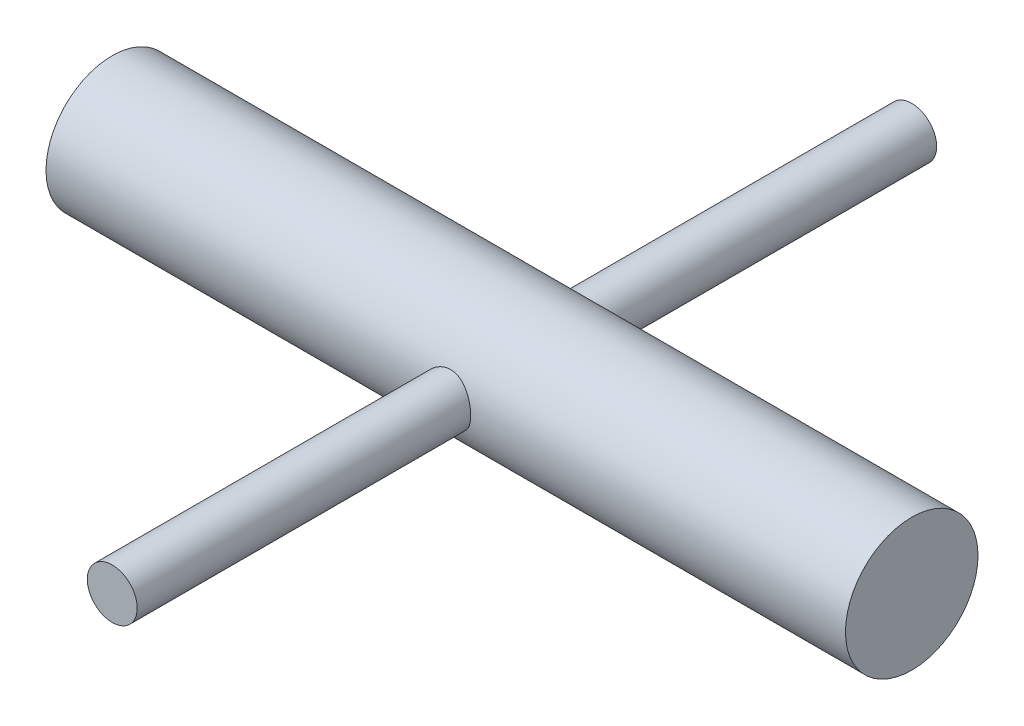
ISO-10303-21;
HEADER;
FILE_DESCRIPTION(('STEP AP214'),'2;1');
FILE_NAME('part.step','',(''),(''),'','','');
FILE_SCHEMA(('AUTOMOTIVE_DESIGN { 1 0 10303 214 1 1 1 1 }'));
ENDSEC;
DATA;
#1=APPLICATION_CONTEXT('core data for automotive mechanical design processes');
#2=APPLICATION_PROTOCOL_DEFINITION('international standard','automotive_design',2000,#1);
#3=PRODUCT_CONTEXT('',#1,'mechanical');
#4=PRODUCT('Part','Part','',(#3));
#5=PRODUCT_RELATED_PRODUCT_CATEGORY('part','',(#4));
#6=PRODUCT_DEFINITION_FORMATION('','',#4);
#7=PRODUCT_DEFINITION_CONTEXT('part definition',#1,'design');
#8=PRODUCT_DEFINITION('design','',#6,#7);
#9=PRODUCT_DEFINITION_SHAPE('','',#8);
#10=(LENGTH_UNIT() NAMED_UNIT(*) SI_UNIT(.MILLI.,.METRE.));
#11=(NAMED_UNIT(*) PLANE_ANGLE_UNIT() SI_UNIT($,.RADIAN.));
#12=(NAMED_UNIT(*) SI_UNIT($,.STERADIAN.) SOLID_ANGLE_UNIT());
#13=UNCERTAINTY_MEASURE_WITH_UNIT(LENGTH_MEASURE(1.E-05),#10,'distance_accuracy_value','');
#14=(GEOMETRIC_REPRESENTATION_CONTEXT(3) GLOBAL_UNCERTAINTY_ASSIGNED_CONTEXT((#13)) GLOBAL_UNIT_ASSIGNED_CONTEXT((#10,
#11,#12)) REPRESENTATION_CONTEXT('',''));
#15=CARTESIAN_POINT('',(0.,0.,0.));
#16=DIRECTION('',(0.,0.,1.));
#17=DIRECTION('',(1.,0.,0.));
#18=AXIS2_PLACEMENT_3D('',#15,#16,#17);
#19=CARTESIAN_POINT('',(0.,0.,-73.3));
#20=DIRECTION('',(0.,0.,-1.));
#21=DIRECTION('',(-1.,0.,0.));
#22=AXIS2_PLACEMENT_3D('',#19,#20,#21);
#23=PLANE('',#22);
#24=CARTESIAN_POINT('',(0.,0.,-73.3));
#25=DIRECTION('',(0.,0.,-1.));
#26=DIRECTION('',(-1.,0.,0.));
#27=AXIS2_PLACEMENT_3D('',#24,#25,#26);
#28=CIRCLE('',#27,4.575);
#29=CARTESIAN_POINT('',(-4.575,0.,-73.3));
#30=VERTEX_POINT('',#29);
#31=EDGE_CURVE('E63',#30,#30,#28,.T.);
#32=ORIENTED_EDGE('',*,*,#31,.T.);
#33=EDGE_LOOP('',(#32));
#34=FACE_BOUND('',#33,.T.);
#35=ADVANCED_FACE('F38',(#34),#23,.T.);
#36=CARTESIAN_POINT('',(73.3,0.,0.));
#37=DIRECTION('',(1.,0.,0.));
#38=DIRECTION('',(0.,0.,-1.));
#39=AXIS2_PLACEMENT_3D('',#36,#37,#38);
#40=PLANE('',#39);
#41=CARTESIAN_POINT('',(73.3,0.,0.));
#42=DIRECTION('',(1.,0.,0.));
#43=DIRECTION('',(0.,0.,-1.));
#44=AXIS2_PLACEMENT_3D('',#41,#42,#43);
#45=CIRCLE('',#44,12.15);
#46=CARTESIAN_POINT('',(73.3,0.,-12.15));
#47=VERTEX_POINT('',#46);
#48=EDGE_CURVE('E92',#47,#47,#45,.T.);
#49=ORIENTED_EDGE('',*,*,#48,.T.);
#50=EDGE_LOOP('',(#49));
#51=FACE_BOUND('',#50,.T.);
#52=ADVANCED_FACE('F79',(#51),#40,.T.);
#53=CARTESIAN_POINT('',(-73.3,0.,0.));
#54=DIRECTION('',(-1.,0.,0.));
#55=DIRECTION('',(0.,0.,1.));
#56=AXIS2_PLACEMENT_3D('',#53,#54,#55);
#57=PLANE('',#56);
#58=CARTESIAN_POINT('',(-73.3,0.,0.));
#59=DIRECTION('',(-1.,0.,0.));
#60=DIRECTION('',(0.,0.,1.));
#61=AXIS2_PLACEMENT_3D('',#58,#59,#60);
#62=CIRCLE('',#61,12.15);
#63=CARTESIAN_POINT('',(-73.3,0.,12.15));
#64=VERTEX_POINT('',#63);
#65=EDGE_CURVE('E54',#64,#64,#62,.T.);
#66=ORIENTED_EDGE('',*,*,#65,.T.);
#67=EDGE_LOOP('',(#66));
#68=FACE_BOUND('',#67,.T.);
#69=ADVANCED_FACE('F71',(#68),#57,.T.);
#70=CARTESIAN_POINT('',(0.,0.,43.5063818745033));
#71=DIRECTION('',(0.,0.,1.));
#72=DIRECTION('',(1.,0.,0.));
#73=AXIS2_PLACEMENT_3D('',#70,#71,#72);
#74=CYLINDRICAL_SURFACE('',#73,4.575);
#75=CARTESIAN_POINT('',(-4.5572713641473,0.402371362702469,-12.1433355090962));
#76=CARTESIAN_POINT('',(-4.54623963613779,0.527320166183875,-12.1391955359476));
#77=CARTESIAN_POINT('',(-4.530070341162,0.651746572801143,-12.1331374214195));
#78=CARTESIAN_POINT('',(-4.48761849930529,0.898668848862046,-12.1173514813608));
#79=CARTESIAN_POINT('',(-4.46133234650556,1.02116401373592,-12.1076223474051));
#80=CARTESIAN_POINT('',(-4.39891429224645,1.26324608709004,-12.0847622086163));
#81=CARTESIAN_POINT('',(-4.36278629998079,1.38283412978434,-12.0716325545769));
#82=CARTESIAN_POINT('',(-4.28102200055736,1.61834531895,-12.0423244401796));
#83=CARTESIAN_POINT('',(-4.23538192465809,1.73426699175435,-12.0261447716321));
#84=CARTESIAN_POINT('',(-4.08501843387116,2.07474645975729,-11.973736388729));
#85=CARTESIAN_POINT('',(-3.96663593249433,2.29284728407199,-11.9335557199056));
#86=CARTESIAN_POINT('',(-3.69709088383053,2.70613174699865,-11.8466925702667));
#87=CARTESIAN_POINT('',(-3.54591995489369,2.90130950612483,-11.800008428073));
#88=CARTESIAN_POINT('',(-3.20751718456373,3.27231905773708,-11.7026801735381));
#89=CARTESIAN_POINT('',(-3.01903702327288,3.44699337253162,-11.6519520925891));
#90=CARTESIAN_POINT('',(-2.6149506540602,3.76276965128456,-11.553851431011));
#91=CARTESIAN_POINT('',(-2.3993396637423,3.90386568363466,-11.5064794442728));
#92=CARTESIAN_POINT('',(-1.94204048643348,4.15063228164699,-11.4198170318512));
#93=CARTESIAN_POINT('',(-1.69995977926796,4.25563489009305,-11.380683699775));
#94=CARTESIAN_POINT('',(-1.19966273013044,4.42276873075131,-11.3167899582724));
#95=CARTESIAN_POINT('',(-0.941455879801031,4.48492492724126,-11.2920211807373));
#96=CARTESIAN_POINT('',(-0.432585598353522,4.56133135530431,-11.2613655480137));
#97=CARTESIAN_POINT('',(-0.18237563574917,4.57819116367335,-11.2544510799045));
#98=CARTESIAN_POINT('',(0.317304948747305,4.57081392391758,-11.257450348055));
#99=CARTESIAN_POINT('',(0.566775711153019,4.54658526535129,-11.2673606489866));
#100=CARTESIAN_POINT('',(1.04668916571543,4.46004240304709,-11.3018810247876));
#101=CARTESIAN_POINT('',(1.27748838059261,4.39941739654753,-11.3258380834739));
#102=CARTESIAN_POINT('',(1.72559918677067,4.2437281579575,-11.385085168497));
#103=CARTESIAN_POINT('',(1.94290779603294,4.14865634307866,-11.420377689919));
#104=CARTESIAN_POINT('',(2.3681254075817,3.9221302009594,-11.5001900462662));
#105=CARTESIAN_POINT('',(2.57523419552576,3.78929302341204,-11.545040123729));
#106=CARTESIAN_POINT('',(2.96511917667295,3.49266993590125,-11.6382084716706));
#107=CARTESIAN_POINT('',(3.14788632357772,3.3288725743382,-11.6865280213291));
#108=CARTESIAN_POINT('',(3.49554266062742,2.96299329286544,-11.7847852027118));
#109=CARTESIAN_POINT('',(3.65863250166113,2.7591725486672,-11.8346386686463));
#110=CARTESIAN_POINT('',(3.94840661946405,2.32565348693053,-11.9274013152261));
#111=CARTESIAN_POINT('',(4.07509255697859,2.09595635053829,-11.9703108126162));
#112=CARTESIAN_POINT('',(4.28690375840924,1.61881468959056,-12.0440699237627));
#113=CARTESIAN_POINT('',(4.37239664869181,1.37155064006296,-12.0750257047305));
#114=CARTESIAN_POINT('',(4.5001154218379,0.864747557525206,-12.1218536499995));
#115=CARTESIAN_POINT('',(4.54236162271805,0.605214348785856,-12.1377328972534));
#116=CARTESIAN_POINT('',(4.58060358662,0.0978098421283498,-12.1521001486047));
#117=CARTESIAN_POINT('',(4.57919149976856,-0.149841261082677,-12.1515628837484));
#118=CARTESIAN_POINT('',(4.53655293840477,-0.641172860539341,-12.1355591496251));
#119=CARTESIAN_POINT('',(4.4953302038667,-0.884853727578458,-12.1200940827366));
#120=CARTESIAN_POINT('',(4.37591572859824,-1.35646693245261,-12.0763209731336));
#121=CARTESIAN_POINT('',(4.29847975614031,-1.58461675283613,-12.0482759407746));
#122=CARTESIAN_POINT('',(4.10954497077791,-2.02476272392649,-11.9821709926763));
#123=CARTESIAN_POINT('',(3.99803925283913,-2.23675558915451,-11.9441090469914));
#124=CARTESIAN_POINT('',(3.73830894443054,-2.64909471673734,-11.8596418483603));
#125=CARTESIAN_POINT('',(3.58864409172169,-2.84847171666603,-11.8129356995458));
#126=CARTESIAN_POINT('',(3.25936207323816,-3.2200793157087,-11.7171023034786));
#127=CARTESIAN_POINT('',(3.07973303216153,-3.39229909911875,-11.6679741017862));
#128=CARTESIAN_POINT('',(2.68454249784013,-3.71373877719059,-11.5698033234297));
#129=CARTESIAN_POINT('',(2.46761724409849,-3.8613413674665,-11.5208924397947));
#130=CARTESIAN_POINT('',(2.12495615629601,-4.05369273435787,-11.454025003065));
#131=CARTESIAN_POINT('',(2.00779299801848,-4.11299050360386,-11.4328098806104));
#132=CARTESIAN_POINT('',(1.7684201354129,-4.2214389548625,-11.3932122346052));
#133=CARTESIAN_POINT('',(1.6462127834264,-4.27059430400729,-11.374828409198));
#134=CARTESIAN_POINT('',(1.40012783289832,-4.35740173934002,-11.3418545585438));
#135=CARTESIAN_POINT('',(1.27633483475098,-4.3952675635432,-11.3271949416737));
#136=CARTESIAN_POINT('',(1.02566159920729,-4.46042622211124,-11.3016956095218));
#137=CARTESIAN_POINT('',(0.898782743152113,-4.48772369792883,-11.290854217525));
#138=CARTESIAN_POINT('',(0.642913971578446,-4.53145981504605,-11.273372530989));
#139=CARTESIAN_POINT('',(0.513924629452984,-4.54790135716799,-11.2667311141914));
#140=CARTESIAN_POINT('',(0.254865649280117,-4.56974425492042,-11.2578896039396));
#141=CARTESIAN_POINT('',(0.124796074940181,-4.57514625703809,-11.2556892504121));
#142=CARTESIAN_POINT('',(-0.126529156359122,-4.57485778118459,-11.2558061820851));
#143=CARTESIAN_POINT('',(-0.247786452796217,-4.5698922262783,-11.2578282288533));
#144=CARTESIAN_POINT('',(-0.489437819437675,-4.55035998376997,-11.2657372000272));
#145=CARTESIAN_POINT('',(-0.609831588551317,-4.53579009760672,-11.2716254119917));
#146=CARTESIAN_POINT('',(-0.848816445912671,-4.49719644710865,-11.2870792068994));
#147=CARTESIAN_POINT('',(-0.967408127362226,-4.47317586692992,-11.2966435512442));
#148=CARTESIAN_POINT('',(-1.20203347048846,-4.4159198784932,-11.3191468798456));
#149=CARTESIAN_POINT('',(-1.31806613580103,-4.38268094709588,-11.3320871542283));
#150=CARTESIAN_POINT('',(-1.66001420664755,-4.26992690424439,-11.3752696465733));
#151=CARTESIAN_POINT('',(-1.8811540002849,-4.17714913216642,-11.4099694063502));
#152=CARTESIAN_POINT('',(-2.30507608364558,-3.95906483733078,-11.4874545141654));
#153=CARTESIAN_POINT('',(-2.50785271855238,-3.8337483401152,-11.5302423404331));
#154=CARTESIAN_POINT('',(-2.90350516748123,-3.54459446829462,-11.6225144559357));
#155=CARTESIAN_POINT('',(-3.09487965635661,-3.37878206119877,-11.6722532691977));
#156=CARTESIAN_POINT('',(-3.44794593575668,-3.01761796076383,-11.7707854990545));
#157=CARTESIAN_POINT('',(-3.60962992875191,-2.82225853207153,-11.8195786642956));
#158=CARTESIAN_POINT('',(-3.82925571749945,-2.5069287172885,-11.8890720316019));
#159=CARTESIAN_POINT('',(-3.89967117198761,-2.395935947103,-11.9119892135556));
#160=CARTESIAN_POINT('',(-4.03084842252769,-2.16798330937672,-11.9555754096534));
#161=CARTESIAN_POINT('',(-4.09161405126156,-2.05102583538236,-11.9762453153283));
#162=CARTESIAN_POINT('',(-4.20298836228903,-1.81188379433445,-12.0147515210819));
#163=CARTESIAN_POINT('',(-4.25359409909111,-1.68969772385857,-12.0325869991099));
#164=CARTESIAN_POINT('',(-4.34413081751991,-1.44105717952418,-12.064889502443));
#165=CARTESIAN_POINT('',(-4.38406662937639,-1.31460466636568,-12.0793580515585));
#166=CARTESIAN_POINT('',(-4.4530157867322,-1.05783598660833,-12.1045524180326));
#167=CARTESIAN_POINT('',(-4.48198453529533,-0.92750632069839,-12.1152629409499));
#168=CARTESIAN_POINT('',(-4.52843716004746,-0.664599478695841,-12.1325245690221));
#169=CARTESIAN_POINT('',(-4.54592601719546,-0.532023302979068,-12.1390774780642));
#170=CARTESIAN_POINT('',(-4.56923313764631,-0.265706966309565,-12.1478248856285));
#171=CARTESIAN_POINT('',(-4.57505158491265,-0.131966823738101,-12.1500194528523));
#172=CARTESIAN_POINT('',(-4.5749477315166,0.13550370355954,-12.1499802897553));
#173=CARTESIAN_POINT('',(-4.56902605212193,0.269234088427573,-12.1477467937602));
#174=CARTESIAN_POINT('',(-4.5572713641473,0.402371362702469,-12.1433355090962));
#175=B_SPLINE_CURVE_WITH_KNOTS('',3,(#75,#76,#77,#78,#79,#80,#81,#82,#83,#84,#85,#86,#87,#88,
#89,#90,#91,#92,#93,#94,#95,#96,#97,#98,#99,#100,#101,#102,#103,#104,#105,#106,#107,#108,#109,
#110,#111,#112,#113,#114,#115,#116,#117,#118,#119,#120,#121,#122,#123,#124,#125,#126,#127,#128,
#129,#130,#131,#132,#133,#134,#135,#136,#137,#138,#139,#140,#141,#142,#143,#144,#145,#146,#147,
#148,#149,#150,#151,#152,#153,#154,#155,#156,#157,#158,#159,#160,#161,#162,#163,#164,#165,#166,
#167,#168,#169,#170,#171,#172,#173,#174),.UNSPECIFIED.,.T.,.F.,(4,2,2,2,2,2,2,2,2,2,2,2,2,2,2,2,
2,2,2,2,2,2,2,2,2,2,2,2,2,2,2,2,2,2,2,2,2,2,2,2,2,2,2,2,2,2,2,2,2,4),(0.,0.376380873286317,
0.752896023208598,1.12926183824651,1.50577705600502,2.25625916555993,3.00693334615737,
3.78914956711456,4.57150386427907,5.36764237650864,6.16331662908874,6.91205609102096,
7.66064269163414,8.37691484815451,9.09334477381327,9.84043371840771,10.5877995400695,
11.3812871626894,12.1747385806712,12.9609713068163,13.7468344779373,14.4861329770858,
15.2253620302798,15.9498084347209,16.6744017627478,17.4319749478844,18.189849088208,
18.9863068997068,19.3849411039578,19.7833914617285,20.173733231017,20.5639033733279,
20.9539692157401,21.3440122148282,21.7076974439387,22.0715038535394,22.4351877932188,
22.7990109203834,23.5225202090683,24.2462515454912,25.0170461824183,25.7880429623103,
26.1879082817922,26.5876143848832,26.9874362014296,27.3870767124756,27.7883253153738,
28.1893997070224,28.5904677763889,28.9915146224758),.UNSPECIFIED.);
#176=CARTESIAN_POINT('',(-4.5572713641473,0.402371362702469,-12.1433355090962));
#177=VERTEX_POINT('',#176);
#178=EDGE_CURVE('E49',#177,#177,#175,.T.);
#179=ORIENTED_EDGE('',*,*,#178,.T.);
#180=EDGE_LOOP('',(#179));
#181=FACE_BOUND('',#180,.T.);
#182=ORIENTED_EDGE('',*,*,#31,.F.);
#183=EDGE_LOOP('',(#182));
#184=FACE_BOUND('',#183,.T.);
#185=ADVANCED_FACE('F68',(#181,#184),#74,.T.);
#186=CARTESIAN_POINT('',(-123.5671875,0.,0.));
#187=DIRECTION('',(-1.,0.,0.));
#188=DIRECTION('',(0.,0.,1.));
#189=AXIS2_PLACEMENT_3D('',#186,#187,#188);
#190=CYLINDRICAL_SURFACE('',#189,12.15);
#191=CARTESIAN_POINT('',(-4.5572713641473,-0.402371362702469,12.1433355090962));
#192=CARTESIAN_POINT('',(-4.54623963613779,-0.527320166183875,12.1391955359476));
#193=CARTESIAN_POINT('',(-4.530070341162,-0.651746572801143,12.1331374214195));
#194=CARTESIAN_POINT('',(-4.48761849930529,-0.898668848862046,12.1173514813608));
#195=CARTESIAN_POINT('',(-4.46133234650556,-1.02116401373592,12.1076223474051));
#196=CARTESIAN_POINT('',(-4.39891429224645,-1.26324608709004,12.0847622086163));
#197=CARTESIAN_POINT('',(-4.36278629998079,-1.38283412978434,12.0716325545769));
#198=CARTESIAN_POINT('',(-4.28102200055736,-1.61834531895,12.0423244401796));
#199=CARTESIAN_POINT('',(-4.23538192465809,-1.73426699175435,12.0261447716321));
#200=CARTESIAN_POINT('',(-4.08501843387116,-2.07474645975729,11.973736388729));
#201=CARTESIAN_POINT('',(-3.96663593249433,-2.29284728407199,11.9335557199056));
#202=CARTESIAN_POINT('',(-3.69709088383053,-2.70613174699865,11.8466925702667));
#203=CARTESIAN_POINT('',(-3.54591995489369,-2.90130950612483,11.800008428073));
#204=CARTESIAN_POINT('',(-3.20751718456373,-3.27231905773708,11.7026801735381));
#205=CARTESIAN_POINT('',(-3.01903702327288,-3.44699337253162,11.6519520925891));
#206=CARTESIAN_POINT('',(-2.6149506540602,-3.76276965128456,11.553851431011));
#207=CARTESIAN_POINT('',(-2.3993396637423,-3.90386568363466,11.5064794442728));
#208=CARTESIAN_POINT('',(-1.94204048643348,-4.15063228164699,11.4198170318512));
#209=CARTESIAN_POINT('',(-1.69995977926796,-4.25563489009305,11.380683699775));
#210=CARTESIAN_POINT('',(-1.19966273013044,-4.42276873075131,11.3167899582724));
#211=CARTESIAN_POINT('',(-0.941455879801031,-4.48492492724126,11.2920211807373));
#212=CARTESIAN_POINT('',(-0.432585598353522,-4.56133135530431,11.2613655480137));
#213=CARTESIAN_POINT('',(-0.18237563574917,-4.57819116367335,11.2544510799045));
#214=CARTESIAN_POINT('',(0.317304948747305,-4.57081392391758,11.257450348055));
#215=CARTESIAN_POINT('',(0.566775711153019,-4.54658526535129,11.2673606489866));
#216=CARTESIAN_POINT('',(1.04668916571543,-4.46004240304709,11.3018810247876));
#217=CARTESIAN_POINT('',(1.27748838059261,-4.39941739654753,11.3258380834739));
#218=CARTESIAN_POINT('',(1.72559918677067,-4.2437281579575,11.385085168497));
#219=CARTESIAN_POINT('',(1.94290779603294,-4.14865634307866,11.420377689919));
#220=CARTESIAN_POINT('',(2.3681254075817,-3.9221302009594,11.5001900462662));
#221=CARTESIAN_POINT('',(2.57523419552576,-3.78929302341204,11.545040123729));
#222=CARTESIAN_POINT('',(2.96511917667295,-3.49266993590125,11.6382084716706));
#223=CARTESIAN_POINT('',(3.14788632357772,-3.3288725743382,11.6865280213291));
#224=CARTESIAN_POINT('',(3.49554266062742,-2.96299329286544,11.7847852027118));
#225=CARTESIAN_POINT('',(3.65863250166113,-2.7591725486672,11.8346386686463));
#226=CARTESIAN_POINT('',(3.94840661946405,-2.32565348693053,11.9274013152261));
#227=CARTESIAN_POINT('',(4.07509255697859,-2.09595635053829,11.9703108126162));
#228=CARTESIAN_POINT('',(4.28690375840924,-1.61881468959056,12.0440699237627));
#229=CARTESIAN_POINT('',(4.37239664869181,-1.37155064006296,12.0750257047305));
#230=CARTESIAN_POINT('',(4.5001154218379,-0.864747557525206,12.1218536499995));
#231=CARTESIAN_POINT('',(4.54236162271805,-0.605214348785856,12.1377328972534));
#232=CARTESIAN_POINT('',(4.58060358662,-0.0978098421283498,12.1521001486047));
#233=CARTESIAN_POINT('',(4.57919149976856,0.149841261082677,12.1515628837484));
#234=CARTESIAN_POINT('',(4.53655293840477,0.641172860539341,12.1355591496251));
#235=CARTESIAN_POINT('',(4.4953302038667,0.884853727578458,12.1200940827366));
#236=CARTESIAN_POINT('',(4.37591572859824,1.35646693245261,12.0763209731336));
#237=CARTESIAN_POINT('',(4.29847975614031,1.58461675283613,12.0482759407746));
#238=CARTESIAN_POINT('',(4.10954497077791,2.02476272392649,11.9821709926763));
#239=CARTESIAN_POINT('',(3.99803925283913,2.23675558915451,11.9441090469914));
#240=CARTESIAN_POINT('',(3.73830894443054,2.64909471673734,11.8596418483603));
#241=CARTESIAN_POINT('',(3.58864409172169,2.84847171666603,11.8129356995458));
#242=CARTESIAN_POINT('',(3.25936207323816,3.2200793157087,11.7171023034786));
#243=CARTESIAN_POINT('',(3.07973303216153,3.39229909911875,11.6679741017862));
#244=CARTESIAN_POINT('',(2.68454249784013,3.71373877719059,11.5698033234297));
#245=CARTESIAN_POINT('',(2.46761724409849,3.8613413674665,11.5208924397947));
#246=CARTESIAN_POINT('',(2.12495615629601,4.05369273435787,11.454025003065));
#247=CARTESIAN_POINT('',(2.00779299801848,4.11299050360386,11.4328098806104));
#248=CARTESIAN_POINT('',(1.7684201354129,4.2214389548625,11.3932122346052));
#249=CARTESIAN_POINT('',(1.6462127834264,4.27059430400729,11.374828409198));
#250=CARTESIAN_POINT('',(1.40012783289832,4.35740173934002,11.3418545585438));
#251=CARTESIAN_POINT('',(1.27633483475098,4.3952675635432,11.3271949416737));
#252=CARTESIAN_POINT('',(1.02566159920729,4.46042622211124,11.3016956095218));
#253=CARTESIAN_POINT('',(0.898782743152113,4.48772369792883,11.290854217525));
#254=CARTESIAN_POINT('',(0.642913971578446,4.53145981504605,11.273372530989));
#255=CARTESIAN_POINT('',(0.513924629452984,4.54790135716799,11.2667311141914));
#256=CARTESIAN_POINT('',(0.254865649280117,4.56974425492042,11.2578896039396));
#257=CARTESIAN_POINT('',(0.124796074940181,4.57514625703809,11.2556892504121));
#258=CARTESIAN_POINT('',(-0.126529156359122,4.57485778118459,11.2558061820851));
#259=CARTESIAN_POINT('',(-0.247786452796217,4.5698922262783,11.2578282288533));
#260=CARTESIAN_POINT('',(-0.489437819437675,4.55035998376997,11.2657372000272));
#261=CARTESIAN_POINT('',(-0.609831588551317,4.53579009760672,11.2716254119917));
#262=CARTESIAN_POINT('',(-0.848816445912671,4.49719644710865,11.2870792068994));
#263=CARTESIAN_POINT('',(-0.967408127362226,4.47317586692992,11.2966435512442));
#264=CARTESIAN_POINT('',(-1.20203347048846,4.4159198784932,11.3191468798456));
#265=CARTESIAN_POINT('',(-1.31806613580103,4.38268094709588,11.3320871542283));
#266=CARTESIAN_POINT('',(-1.66001420664755,4.26992690424439,11.3752696465733));
#267=CARTESIAN_POINT('',(-1.8811540002849,4.17714913216642,11.4099694063502));
#268=CARTESIAN_POINT('',(-2.30507608364558,3.95906483733078,11.4874545141654));
#269=CARTESIAN_POINT('',(-2.50785271855238,3.8337483401152,11.5302423404331));
#270=CARTESIAN_POINT('',(-2.90350516748123,3.54459446829462,11.6225144559357));
#271=CARTESIAN_POINT('',(-3.09487965635661,3.37878206119877,11.6722532691977));
#272=CARTESIAN_POINT('',(-3.44794593575668,3.01761796076383,11.7707854990545));
#273=CARTESIAN_POINT('',(-3.60962992875191,2.82225853207153,11.8195786642956));
#274=CARTESIAN_POINT('',(-3.82925571749945,2.5069287172885,11.8890720316019));
#275=CARTESIAN_POINT('',(-3.89967117198761,2.395935947103,11.9119892135556));
#276=CARTESIAN_POINT('',(-4.03084842252769,2.16798330937672,11.9555754096534));
#277=CARTESIAN_POINT('',(-4.09161405126156,2.05102583538236,11.9762453153283));
#278=CARTESIAN_POINT('',(-4.20298836228903,1.81188379433445,12.0147515210819));
#279=CARTESIAN_POINT('',(-4.25359409909111,1.68969772385857,12.0325869991099));
#280=CARTESIAN_POINT('',(-4.34413081751991,1.44105717952418,12.064889502443));
#281=CARTESIAN_POINT('',(-4.38406662937639,1.31460466636568,12.0793580515585));
#282=CARTESIAN_POINT('',(-4.4530157867322,1.05783598660833,12.1045524180326));
#283=CARTESIAN_POINT('',(-4.48198453529533,0.92750632069839,12.1152629409499));
#284=CARTESIAN_POINT('',(-4.52843716004746,0.664599478695841,12.1325245690221));
#285=CARTESIAN_POINT('',(-4.54592601719546,0.532023302979068,12.1390774780642));
#286=CARTESIAN_POINT('',(-4.56923313764631,0.265706966309565,12.1478248856285));
#287=CARTESIAN_POINT('',(-4.57505158491265,0.131966823738101,12.1500194528523));
#288=CARTESIAN_POINT('',(-4.5749477315166,-0.13550370355954,12.1499802897553));
#289=CARTESIAN_POINT('',(-4.56902605212193,-0.269234088427573,12.1477467937602));
#290=CARTESIAN_POINT('',(-4.5572713641473,-0.402371362702469,12.1433355090962));
#291=B_SPLINE_CURVE_WITH_KNOTS('',3,(#191,#192,#193,#194,#195,#196,#197,#198,#199,#200,#201,
#202,#203,#204,#205,#206,#207,#208,#209,#210,#211,#212,#213,#214,#215,#216,#217,#218,#219,#220,
#221,#222,#223,#224,#225,#226,#227,#228,#229,#230,#231,#232,#233,#234,#235,#236,#237,#238,#239,
#240,#241,#242,#243,#244,#245,#246,#247,#248,#249,#250,#251,#252,#253,#254,#255,#256,#257,#258,
#259,#260,#261,#262,#263,#264,#265,#266,#267,#268,#269,#270,#271,#272,#273,#274,#275,#276,#277,
#278,#279,#280,#281,#282,#283,#284,#285,#286,#287,#288,#289,#290),.UNSPECIFIED.,.T.,.F.,(4,2,2,
2,2,2,2,2,2,2,2,2,2,2,2,2,2,2,2,2,2,2,2,2,2,2,2,2,2,2,2,2,2,2,2,2,2,2,2,2,2,2,2,2,2,2,2,2,2,4),
(0.,0.376380873286317,0.752896023208598,1.12926183824651,1.50577705600502,2.25625916555993,
3.00693334615737,3.78914956711456,4.57150386427907,5.36764237650864,6.16331662908874,
6.91205609102096,7.66064269163414,8.37691484815451,9.09334477381327,9.84043371840771,
10.5877995400695,11.3812871626894,12.1747385806712,12.9609713068163,13.7468344779373,
14.4861329770858,15.2253620302798,15.9498084347209,16.6744017627478,17.4319749478844,
18.189849088208,18.9863068997068,19.3849411039578,19.7833914617285,20.173733231017,
20.5639033733279,20.9539692157401,21.3440122148282,21.7076974439387,22.0715038535394,
22.4351877932188,22.7990109203834,23.5225202090683,24.2462515454912,25.0170461824183,
25.7880429623103,26.1879082817922,26.5876143848832,26.9874362014296,27.3870767124756,
27.7883253153738,28.1893997070224,28.5904677763889,28.9915146224758),.UNSPECIFIED.);
#292=CARTESIAN_POINT('',(-4.5572713641473,-0.402371362702469,12.1433355090962));
#293=VERTEX_POINT('',#292);
#294=EDGE_CURVE('E45',#293,#293,#291,.T.);
#295=ORIENTED_EDGE('',*,*,#294,.F.);
#296=EDGE_LOOP('',(#295));
#297=FACE_BOUND('',#296,.T.);
#298=ORIENTED_EDGE('',*,*,#178,.F.);
#299=EDGE_LOOP('',(#298));
#300=FACE_BOUND('',#299,.T.);
#301=ORIENTED_EDGE('',*,*,#65,.F.);
#302=EDGE_LOOP('',(#301));
#303=FACE_BOUND('',#302,.T.);
#304=ORIENTED_EDGE('',*,*,#48,.F.);
#305=EDGE_LOOP('',(#304));
#306=FACE_BOUND('',#305,.T.);
#307=ADVANCED_FACE('F65',(#297,#300,#303,#306),#190,.T.);
#308=ORIENTED_EDGE('',*,*,#294,.T.);
#309=EDGE_LOOP('',(#308));
#310=FACE_BOUND('',#309,.T.);
#311=CARTESIAN_POINT('',(0.,0.,73.3));
#312=DIRECTION('',(0.,0.,1.));
#313=DIRECTION('',(1.,0.,0.));
#314=AXIS2_PLACEMENT_3D('',#311,#312,#313);
#315=CIRCLE('',#314,4.575);
#316=CARTESIAN_POINT('',(4.575,0.,73.3));
#317=VERTEX_POINT('',#316);
#318=EDGE_CURVE('E11',#317,#317,#315,.T.);
#319=ORIENTED_EDGE('',*,*,#318,.F.);
#320=EDGE_LOOP('',(#319));
#321=FACE_BOUND('',#320,.T.);
#322=ADVANCED_FACE('F73',(#310,#321),#74,.T.);
#323=CARTESIAN_POINT('',(0.,0.,73.3));
#324=DIRECTION('',(0.,0.,1.));
#325=DIRECTION('',(1.,0.,0.));
#326=AXIS2_PLACEMENT_3D('',#323,#324,#325);
#327=PLANE('',#326);
#328=ORIENTED_EDGE('',*,*,#318,.T.);
#329=EDGE_LOOP('',(#328));
#330=FACE_BOUND('',#329,.T.);
#331=ADVANCED_FACE('F40',(#330),#327,.T.);
#332=CLOSED_SHELL('',(#35,#52,#69,#185,#307,#322,#331));
#333=MANIFOLD_SOLID_BREP('B2',#332);
#334=ADVANCED_BREP_SHAPE_REPRESENTATION('',(#18,#333),#14);
#335=SHAPE_DEFINITION_REPRESENTATION(#9,#334);
ENDSEC;
END-ISO-10303-21;
